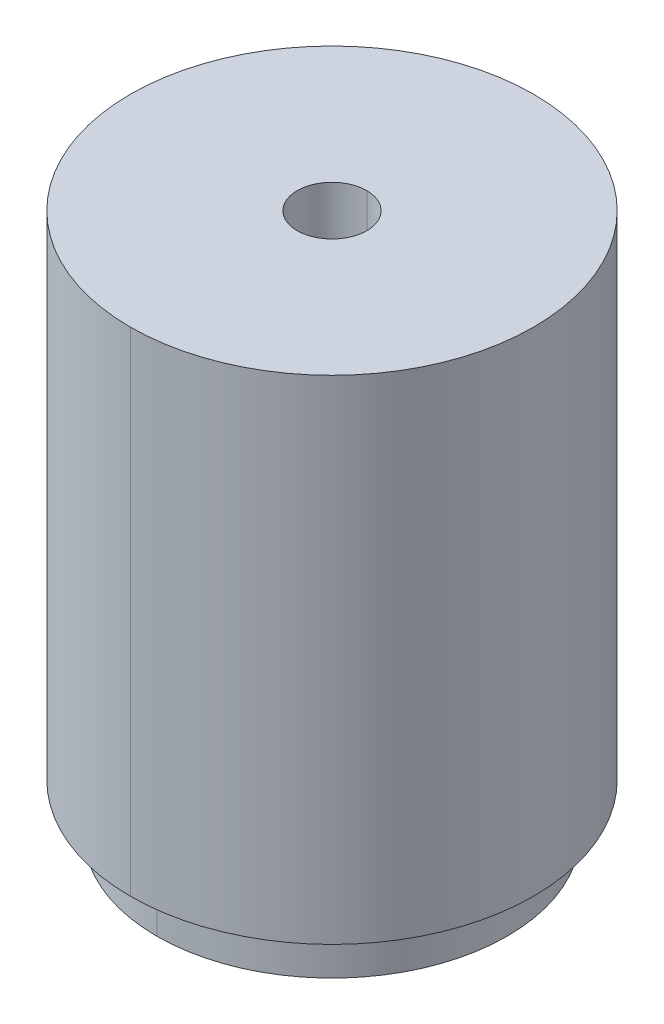
ISO-10303-21;
HEADER;
FILE_DESCRIPTION(('STEP AP214'),'2;1');
FILE_NAME('part.step','',(''),(''),'','','');
FILE_SCHEMA(('AUTOMOTIVE_DESIGN { 1 0 10303 214 1 1 1 1 }'));
ENDSEC;
DATA;
#1=APPLICATION_CONTEXT('core data for automotive mechanical design processes');
#2=APPLICATION_PROTOCOL_DEFINITION('international standard','automotive_design',2000,#1);
#3=PRODUCT_CONTEXT('',#1,'mechanical');
#4=PRODUCT('Part','Part','',(#3));
#5=PRODUCT_RELATED_PRODUCT_CATEGORY('part','',(#4));
#6=PRODUCT_DEFINITION_FORMATION('','',#4);
#7=PRODUCT_DEFINITION_CONTEXT('part definition',#1,'design');
#8=PRODUCT_DEFINITION('design','',#6,#7);
#9=PRODUCT_DEFINITION_SHAPE('','',#8);
#10=(LENGTH_UNIT() NAMED_UNIT(*) SI_UNIT(.MILLI.,.METRE.));
#11=(NAMED_UNIT(*) PLANE_ANGLE_UNIT() SI_UNIT($,.RADIAN.));
#12=(NAMED_UNIT(*) SI_UNIT($,.STERADIAN.) SOLID_ANGLE_UNIT());
#13=UNCERTAINTY_MEASURE_WITH_UNIT(LENGTH_MEASURE(1.E-05),#10,'distance_accuracy_value','');
#14=(GEOMETRIC_REPRESENTATION_CONTEXT(3) GLOBAL_UNCERTAINTY_ASSIGNED_CONTEXT((#13)) GLOBAL_UNIT_ASSIGNED_CONTEXT((#10,
#11,#12)) REPRESENTATION_CONTEXT('',''));
#15=CARTESIAN_POINT('',(0.,0.,0.));
#16=DIRECTION('',(0.,0.,1.));
#17=DIRECTION('',(1.,0.,0.));
#18=AXIS2_PLACEMENT_3D('',#15,#16,#17);
#19=CARTESIAN_POINT('',(0.,2.48,0.));
#20=DIRECTION('',(0.,1.,0.));
#21=DIRECTION('',(-1.,0.,0.));
#22=AXIS2_PLACEMENT_3D('',#19,#20,#21);
#23=CYLINDRICAL_SURFACE('',#22,0.625);
#24=CARTESIAN_POINT('',(0.,2.55,0.));
#25=DIRECTION('',(0.,-1.,0.));
#26=DIRECTION('',(0.,0.,-1.));
#27=AXIS2_PLACEMENT_3D('',#24,#25,#26);
#28=CIRCLE('',#27,0.625);
#29=CARTESIAN_POINT('',(0.,2.55,-0.625));
#30=VERTEX_POINT('',#29);
#31=CARTESIAN_POINT('',(0.,2.55,0.625));
#32=VERTEX_POINT('',#31);
#33=EDGE_CURVE('E11',#30,#32,#28,.T.);
#34=ORIENTED_EDGE('',*,*,#33,.T.);
#35=DIRECTION('',(0.,1.,0.));
#36=VECTOR('',#35,1.);
#37=CARTESIAN_POINT('',(0.,2.55,0.625));
#38=LINE('',#37,#36);
#39=CARTESIAN_POINT('',(0.,12.27,0.625));
#40=VERTEX_POINT('',#39);
#41=EDGE_CURVE('E25',#32,#40,#38,.T.);
#42=ORIENTED_EDGE('',*,*,#41,.T.);
#43=CARTESIAN_POINT('',(0.,12.27,0.));
#44=DIRECTION('',(0.,-1.,0.));
#45=DIRECTION('',(0.,0.,-1.));
#46=AXIS2_PLACEMENT_3D('',#43,#44,#45);
#47=CIRCLE('',#46,0.625);
#48=CARTESIAN_POINT('',(0.,12.27,-0.625));
#49=VERTEX_POINT('',#48);
#50=EDGE_CURVE('E136',#49,#40,#47,.T.);
#51=ORIENTED_EDGE('',*,*,#50,.F.);
#52=DIRECTION('',(0.,1.,0.));
#53=VECTOR('',#52,1.);
#54=CARTESIAN_POINT('',(0.,2.55,-0.625));
#55=LINE('',#54,#53);
#56=EDGE_CURVE('E131',#30,#49,#55,.T.);
#57=ORIENTED_EDGE('',*,*,#56,.F.);
#58=EDGE_LOOP('',(#34,#42,#51,#57));
#59=FACE_BOUND('',#58,.T.);
#60=ADVANCED_FACE('F17',(#59),#23,.F.);
#61=CARTESIAN_POINT('',(0.,2.48,0.));
#62=DIRECTION('',(0.,1.,0.));
#63=DIRECTION('',(1.,0.,0.));
#64=AXIS2_PLACEMENT_3D('',#61,#62,#63);
#65=CYLINDRICAL_SURFACE('',#64,0.625);
#66=CARTESIAN_POINT('',(0.,12.27,0.));
#67=DIRECTION('',(0.,-1.,0.));
#68=DIRECTION('',(0.,0.,-1.));
#69=AXIS2_PLACEMENT_3D('',#66,#67,#68);
#70=CIRCLE('',#69,0.625);
#71=EDGE_CURVE('E126',#40,#49,#70,.T.);
#72=ORIENTED_EDGE('',*,*,#71,.F.);
#73=ORIENTED_EDGE('',*,*,#41,.F.);
#74=CARTESIAN_POINT('',(0.,2.55,0.));
#75=DIRECTION('',(0.,-1.,0.));
#76=DIRECTION('',(0.,0.,-1.));
#77=AXIS2_PLACEMENT_3D('',#74,#75,#76);
#78=CIRCLE('',#77,0.625);
#79=EDGE_CURVE('E121',#32,#30,#78,.T.);
#80=ORIENTED_EDGE('',*,*,#79,.T.);
#81=ORIENTED_EDGE('',*,*,#56,.T.);
#82=EDGE_LOOP('',(#72,#73,#80,#81));
#83=FACE_BOUND('',#82,.T.);
#84=ADVANCED_FACE('F147',(#83),#65,.F.);
#85=CARTESIAN_POINT('',(0.625,2.55,0.));
#86=DIRECTION('',(0.,-1.,0.));
#87=DIRECTION('',(0.,0.,-1.));
#88=AXIS2_PLACEMENT_3D('',#85,#86,#87);
#89=PLANE('',#88);
#90=CARTESIAN_POINT('',(0.,2.55,0.));
#91=DIRECTION('',(0.,-1.,0.));
#92=DIRECTION('',(0.,0.,-1.));
#93=AXIS2_PLACEMENT_3D('',#90,#91,#92);
#94=CIRCLE('',#93,3.15);
#95=CARTESIAN_POINT('',(0.,2.55,-3.15));
#96=VERTEX_POINT('',#95);
#97=CARTESIAN_POINT('',(0.,2.55,3.15));
#98=VERTEX_POINT('',#97);
#99=EDGE_CURVE('E117',#96,#98,#94,.T.);
#100=ORIENTED_EDGE('',*,*,#99,.T.);
#101=CARTESIAN_POINT('',(0.,2.55,0.));
#102=DIRECTION('',(0.,-1.,0.));
#103=DIRECTION('',(0.,0.,-1.));
#104=AXIS2_PLACEMENT_3D('',#101,#102,#103);
#105=CIRCLE('',#104,3.15);
#106=EDGE_CURVE('E113',#98,#96,#105,.T.);
#107=ORIENTED_EDGE('',*,*,#106,.T.);
#108=EDGE_LOOP('',(#100,#107));
#109=FACE_BOUND('',#108,.T.);
#110=ORIENTED_EDGE('',*,*,#33,.F.);
#111=ORIENTED_EDGE('',*,*,#79,.F.);
#112=EDGE_LOOP('',(#110,#111));
#113=FACE_BOUND('',#112,.T.);
#114=ADVANCED_FACE('F150',(#109,#113),#89,.T.);
#115=CARTESIAN_POINT('',(0.,2.48,0.));
#116=DIRECTION('',(0.,1.,0.));
#117=DIRECTION('',(1.,0.,0.));
#118=AXIS2_PLACEMENT_3D('',#115,#116,#117);
#119=CYLINDRICAL_SURFACE('',#118,3.15);
#120=CARTESIAN_POINT('',(0.,3.41,0.));
#121=DIRECTION('',(0.,-1.,0.));
#122=DIRECTION('',(0.,0.,-1.));
#123=AXIS2_PLACEMENT_3D('',#120,#121,#122);
#124=CIRCLE('',#123,3.15);
#125=CARTESIAN_POINT('',(0.,3.41,3.15));
#126=VERTEX_POINT('',#125);
#127=CARTESIAN_POINT('',(0.,3.41,-3.15));
#128=VERTEX_POINT('',#127);
#129=EDGE_CURVE('E109',#126,#128,#124,.T.);
#130=ORIENTED_EDGE('',*,*,#129,.T.);
#131=DIRECTION('',(0.,1.,0.));
#132=VECTOR('',#131,1.);
#133=CARTESIAN_POINT('',(0.,2.55,-3.15));
#134=LINE('',#133,#132);
#135=EDGE_CURVE('E104',#96,#128,#134,.T.);
#136=ORIENTED_EDGE('',*,*,#135,.F.);
#137=ORIENTED_EDGE('',*,*,#106,.F.);
#138=DIRECTION('',(0.,1.,0.));
#139=VECTOR('',#138,1.);
#140=CARTESIAN_POINT('',(0.,2.55,3.15));
#141=LINE('',#140,#139);
#142=EDGE_CURVE('E100',#98,#126,#141,.T.);
#143=ORIENTED_EDGE('',*,*,#142,.T.);
#144=EDGE_LOOP('',(#130,#136,#137,#143));
#145=FACE_BOUND('',#144,.T.);
#146=ADVANCED_FACE('F152',(#145),#119,.T.);
#147=CARTESIAN_POINT('',(0.,2.48,0.));
#148=DIRECTION('',(0.,1.,0.));
#149=DIRECTION('',(-1.,0.,0.));
#150=AXIS2_PLACEMENT_3D('',#147,#148,#149);
#151=CYLINDRICAL_SURFACE('',#150,3.15);
#152=ORIENTED_EDGE('',*,*,#99,.F.);
#153=ORIENTED_EDGE('',*,*,#135,.T.);
#154=CARTESIAN_POINT('',(0.,3.41,0.));
#155=DIRECTION('',(0.,-1.,0.));
#156=DIRECTION('',(0.,0.,-1.));
#157=AXIS2_PLACEMENT_3D('',#154,#155,#156);
#158=CIRCLE('',#157,3.15);
#159=EDGE_CURVE('E95',#128,#126,#158,.T.);
#160=ORIENTED_EDGE('',*,*,#159,.T.);
#161=ORIENTED_EDGE('',*,*,#142,.F.);
#162=EDGE_LOOP('',(#152,#153,#160,#161));
#163=FACE_BOUND('',#162,.T.);
#164=ADVANCED_FACE('F160',(#163),#151,.T.);
#165=CARTESIAN_POINT('',(3.15,3.41,0.));
#166=DIRECTION('',(0.,-1.,0.));
#167=DIRECTION('',(0.,0.,-1.));
#168=AXIS2_PLACEMENT_3D('',#165,#166,#167);
#169=PLANE('',#168);
#170=CARTESIAN_POINT('',(0.,3.41,0.));
#171=DIRECTION('',(0.,-1.,0.));
#172=DIRECTION('',(0.,0.,-1.));
#173=AXIS2_PLACEMENT_3D('',#170,#171,#172);
#174=CIRCLE('',#173,3.625);
#175=CARTESIAN_POINT('',(0.,3.41,-3.625));
#176=VERTEX_POINT('',#175);
#177=CARTESIAN_POINT('',(0.,3.41,3.625));
#178=VERTEX_POINT('',#177);
#179=EDGE_CURVE('E84',#176,#178,#174,.T.);
#180=ORIENTED_EDGE('',*,*,#179,.T.);
#181=CARTESIAN_POINT('',(0.,3.41,0.));
#182=DIRECTION('',(0.,-1.,0.));
#183=DIRECTION('',(0.,0.,-1.));
#184=AXIS2_PLACEMENT_3D('',#181,#182,#183);
#185=CIRCLE('',#184,3.625);
#186=EDGE_CURVE('E72',#178,#176,#185,.T.);
#187=ORIENTED_EDGE('',*,*,#186,.T.);
#188=EDGE_LOOP('',(#180,#187));
#189=FACE_BOUND('',#188,.T.);
#190=ORIENTED_EDGE('',*,*,#159,.F.);
#191=ORIENTED_EDGE('',*,*,#129,.F.);
#192=EDGE_LOOP('',(#190,#191));
#193=FACE_BOUND('',#192,.T.);
#194=ADVANCED_FACE('F189',(#189,#193),#169,.T.);
#195=CARTESIAN_POINT('',(0.,2.48,0.));
#196=DIRECTION('',(0.,1.,0.));
#197=DIRECTION('',(1.,0.,0.));
#198=AXIS2_PLACEMENT_3D('',#195,#196,#197);
#199=CYLINDRICAL_SURFACE('',#198,3.625);
#200=CARTESIAN_POINT('',(0.,12.27,0.));
#201=DIRECTION('',(0.,-1.,0.));
#202=DIRECTION('',(0.,0.,-1.));
#203=AXIS2_PLACEMENT_3D('',#200,#201,#202);
#204=CIRCLE('',#203,3.625);
#205=CARTESIAN_POINT('',(0.,12.27,3.625));
#206=VERTEX_POINT('',#205);
#207=CARTESIAN_POINT('',(0.,12.27,-3.625));
#208=VERTEX_POINT('',#207);
#209=EDGE_CURVE('E70',#206,#208,#204,.T.);
#210=ORIENTED_EDGE('',*,*,#209,.T.);
#211=DIRECTION('',(0.,1.,0.));
#212=VECTOR('',#211,1.);
#213=CARTESIAN_POINT('',(0.,3.41,-3.625));
#214=LINE('',#213,#212);
#215=EDGE_CURVE('E75',#176,#208,#214,.T.);
#216=ORIENTED_EDGE('',*,*,#215,.F.);
#217=ORIENTED_EDGE('',*,*,#186,.F.);
#218=DIRECTION('',(0.,1.,0.));
#219=VECTOR('',#218,1.);
#220=CARTESIAN_POINT('',(0.,3.41,3.625));
#221=LINE('',#220,#219);
#222=EDGE_CURVE('E65',#178,#206,#221,.T.);
#223=ORIENTED_EDGE('',*,*,#222,.T.);
#224=EDGE_LOOP('',(#210,#216,#217,#223));
#225=FACE_BOUND('',#224,.T.);
#226=ADVANCED_FACE('F67',(#225),#199,.T.);
#227=CARTESIAN_POINT('',(0.,2.48,0.));
#228=DIRECTION('',(0.,1.,0.));
#229=DIRECTION('',(-1.,0.,0.));
#230=AXIS2_PLACEMENT_3D('',#227,#228,#229);
#231=CYLINDRICAL_SURFACE('',#230,3.625);
#232=ORIENTED_EDGE('',*,*,#179,.F.);
#233=ORIENTED_EDGE('',*,*,#215,.T.);
#234=CARTESIAN_POINT('',(0.,12.27,0.));
#235=DIRECTION('',(0.,-1.,0.));
#236=DIRECTION('',(0.,0.,-1.));
#237=AXIS2_PLACEMENT_3D('',#234,#235,#236);
#238=CIRCLE('',#237,3.625);
#239=EDGE_CURVE('E76',#208,#206,#238,.T.);
#240=ORIENTED_EDGE('',*,*,#239,.T.);
#241=ORIENTED_EDGE('',*,*,#222,.F.);
#242=EDGE_LOOP('',(#232,#233,#240,#241));
#243=FACE_BOUND('',#242,.T.);
#244=ADVANCED_FACE('F79',(#243),#231,.T.);
#245=CARTESIAN_POINT('',(3.625,12.27,0.));
#246=DIRECTION('',(0.,1.,0.));
#247=DIRECTION('',(0.,0.,1.));
#248=AXIS2_PLACEMENT_3D('',#245,#246,#247);
#249=PLANE('',#248);
#250=ORIENTED_EDGE('',*,*,#50,.T.);
#251=ORIENTED_EDGE('',*,*,#71,.T.);
#252=EDGE_LOOP('',(#250,#251));
#253=FACE_BOUND('',#252,.T.);
#254=ORIENTED_EDGE('',*,*,#239,.F.);
#255=ORIENTED_EDGE('',*,*,#209,.F.);
#256=EDGE_LOOP('',(#254,#255));
#257=FACE_BOUND('',#256,.T.);
#258=ADVANCED_FACE('F82',(#253,#257),#249,.T.);
#259=CLOSED_SHELL('',(#60,#84,#114,#146,#164,#194,#226,#244,#258));
#260=MANIFOLD_SOLID_BREP('B1',#259);
#261=ADVANCED_BREP_SHAPE_REPRESENTATION('',(#18,#260),#14);
#262=SHAPE_DEFINITION_REPRESENTATION(#9,#261);
ENDSEC;
END-ISO-10303-21;
